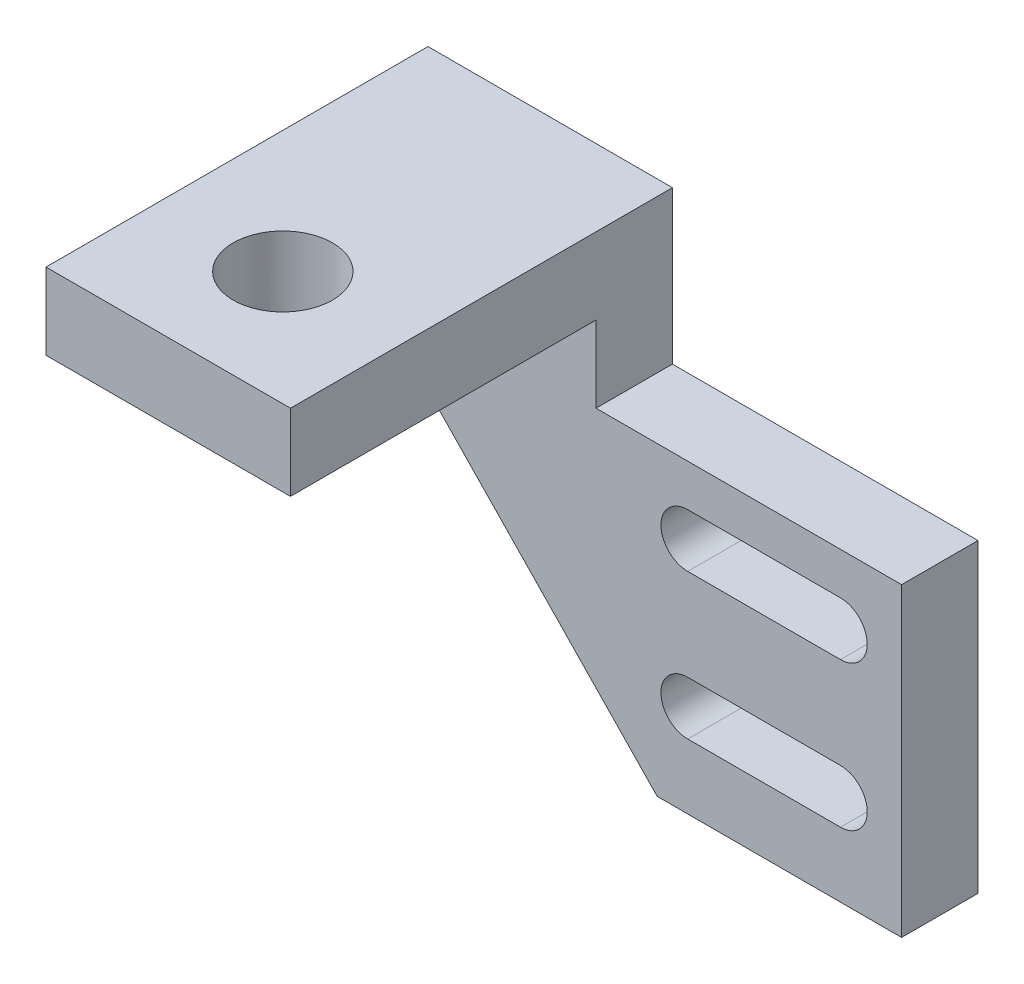
ISO-10303-21;
HEADER;
FILE_DESCRIPTION(('STEP AP214'),'2;1');
FILE_NAME('part.step','',(''),(''),'','','');
FILE_SCHEMA(('AUTOMOTIVE_DESIGN { 1 0 10303 214 1 1 1 1 }'));
ENDSEC;
DATA;
#1=APPLICATION_CONTEXT('core data for automotive mechanical design processes');
#2=APPLICATION_PROTOCOL_DEFINITION('international standard','automotive_design',2000,#1);
#3=PRODUCT_CONTEXT('',#1,'mechanical');
#4=PRODUCT('Part','Part','',(#3));
#5=PRODUCT_RELATED_PRODUCT_CATEGORY('part','',(#4));
#6=PRODUCT_DEFINITION_FORMATION('','',#4);
#7=PRODUCT_DEFINITION_CONTEXT('part definition',#1,'design');
#8=PRODUCT_DEFINITION('design','',#6,#7);
#9=PRODUCT_DEFINITION_SHAPE('','',#8);
#10=(LENGTH_UNIT() NAMED_UNIT(*) SI_UNIT(.MILLI.,.METRE.));
#11=(NAMED_UNIT(*) PLANE_ANGLE_UNIT() SI_UNIT($,.RADIAN.));
#12=(NAMED_UNIT(*) SI_UNIT($,.STERADIAN.) SOLID_ANGLE_UNIT());
#13=UNCERTAINTY_MEASURE_WITH_UNIT(LENGTH_MEASURE(1.E-05),#10,'distance_accuracy_value','');
#14=(GEOMETRIC_REPRESENTATION_CONTEXT(3) GLOBAL_UNCERTAINTY_ASSIGNED_CONTEXT((#13)) GLOBAL_UNIT_ASSIGNED_CONTEXT((#10,
#11,#12)) REPRESENTATION_CONTEXT('',''));
#15=CARTESIAN_POINT('',(0.,0.,0.));
#16=DIRECTION('',(0.,0.,1.));
#17=DIRECTION('',(1.,0.,0.));
#18=AXIS2_PLACEMENT_3D('',#15,#16,#17);
#19=CARTESIAN_POINT('',(0.,0.,5.));
#20=DIRECTION('',(0.,0.,-1.));
#21=DIRECTION('',(-1.,0.,0.));
#22=AXIS2_PLACEMENT_3D('',#19,#20,#21);
#23=PLANE('',#22);
#24=CARTESIAN_POINT('',(16.,-14.5,5.));
#25=DIRECTION('',(0.,0.,1.));
#26=DIRECTION('',(1.,0.,0.));
#27=AXIS2_PLACEMENT_3D('',#24,#25,#26);
#28=CIRCLE('',#27,1.75);
#29=CARTESIAN_POINT('',(16.,-16.25,5.));
#30=VERTEX_POINT('',#29);
#31=CARTESIAN_POINT('',(16.,-12.75,5.));
#32=VERTEX_POINT('',#31);
#33=EDGE_CURVE('E193',#30,#32,#28,.T.);
#34=ORIENTED_EDGE('',*,*,#33,.F.);
#35=DIRECTION('',(1.,0.,0.));
#36=VECTOR('',#35,1.);
#37=CARTESIAN_POINT('',(16.,-16.25,5.));
#38=LINE('',#37,#36);
#39=CARTESIAN_POINT('',(6.,-16.25,5.));
#40=VERTEX_POINT('',#39);
#41=EDGE_CURVE('E213',#40,#30,#38,.T.);
#42=ORIENTED_EDGE('',*,*,#41,.F.);
#43=CARTESIAN_POINT('',(6.,-14.5,5.));
#44=DIRECTION('',(0.,0.,1.));
#45=DIRECTION('',(1.,0.,0.));
#46=AXIS2_PLACEMENT_3D('',#43,#44,#45);
#47=CIRCLE('',#46,1.75);
#48=CARTESIAN_POINT('',(6.,-12.75,5.));
#49=VERTEX_POINT('',#48);
#50=EDGE_CURVE('E527',#49,#40,#47,.T.);
#51=ORIENTED_EDGE('',*,*,#50,.F.);
#52=DIRECTION('',(-1.,0.,0.));
#53=VECTOR('',#52,1.);
#54=CARTESIAN_POINT('',(16.,-12.75,5.));
#55=LINE('',#54,#53);
#56=EDGE_CURVE('E526',#32,#49,#55,.T.);
#57=ORIENTED_EDGE('',*,*,#56,.F.);
#58=EDGE_LOOP('',(#34,#42,#51,#57));
#59=FACE_BOUND('',#58,.T.);
#60=CARTESIAN_POINT('',(16.,-24.,5.));
#61=DIRECTION('',(0.,0.,1.));
#62=DIRECTION('',(1.,0.,0.));
#63=AXIS2_PLACEMENT_3D('',#60,#61,#62);
#64=CIRCLE('',#63,1.75);
#65=CARTESIAN_POINT('',(16.,-25.75,5.));
#66=VERTEX_POINT('',#65);
#67=CARTESIAN_POINT('',(16.,-22.25,5.));
#68=VERTEX_POINT('',#67);
#69=EDGE_CURVE('E230',#66,#68,#64,.T.);
#70=ORIENTED_EDGE('',*,*,#69,.F.);
#71=DIRECTION('',(1.,0.,0.));
#72=VECTOR('',#71,1.);
#73=CARTESIAN_POINT('',(16.,-25.75,5.));
#74=LINE('',#73,#72);
#75=CARTESIAN_POINT('',(6.,-25.75,5.));
#76=VERTEX_POINT('',#75);
#77=EDGE_CURVE('E238',#76,#66,#74,.T.);
#78=ORIENTED_EDGE('',*,*,#77,.F.);
#79=CARTESIAN_POINT('',(6.,-24.,5.));
#80=DIRECTION('',(0.,0.,1.));
#81=DIRECTION('',(1.,0.,0.));
#82=AXIS2_PLACEMENT_3D('',#79,#80,#81);
#83=CIRCLE('',#82,1.75000000000001);
#84=CARTESIAN_POINT('',(6.,-22.25,5.));
#85=VERTEX_POINT('',#84);
#86=EDGE_CURVE('E235',#85,#76,#83,.T.);
#87=ORIENTED_EDGE('',*,*,#86,.F.);
#88=DIRECTION('',(-1.,0.,0.));
#89=VECTOR('',#88,1.);
#90=CARTESIAN_POINT('',(16.,-22.25,5.));
#91=LINE('',#90,#89);
#92=EDGE_CURVE('E232',#68,#85,#91,.T.);
#93=ORIENTED_EDGE('',*,*,#92,.F.);
#94=EDGE_LOOP('',(#70,#78,#87,#93));
#95=FACE_BOUND('',#94,.T.);
#96=DIRECTION('',(1.,0.,0.));
#97=VECTOR('',#96,1.);
#98=CARTESIAN_POINT('',(-16.,-5.,5.));
#99=LINE('',#98,#97);
#100=CARTESIAN_POINT('',(-16.,-5.,5.));
#101=VERTEX_POINT('',#100);
#102=CARTESIAN_POINT('',(0.,-5.,5.));
#103=VERTEX_POINT('',#102);
#104=EDGE_CURVE('E52',#101,#103,#99,.T.);
#105=ORIENTED_EDGE('',*,*,#104,.F.);
#106=DIRECTION('',(0.,-1.,0.));
#107=VECTOR('',#106,1.);
#108=CARTESIAN_POINT('',(-16.,-9.29520131554418,5.));
#109=LINE('',#108,#107);
#110=CARTESIAN_POINT('',(-16.,-9.29520131554418,5.));
#111=VERTEX_POINT('',#110);
#112=EDGE_CURVE('E265',#101,#111,#109,.T.);
#113=ORIENTED_EDGE('',*,*,#112,.T.);
#114=DIRECTION('',(0.694759174123314,-0.7192424417201,0.));
#115=VECTOR('',#114,1.);
#116=CARTESIAN_POINT('',(4.,-30.,5.));
#117=LINE('',#116,#115);
#118=CARTESIAN_POINT('',(4.,-30.,5.));
#119=VERTEX_POINT('',#118);
#120=EDGE_CURVE('E263',#111,#119,#117,.T.);
#121=ORIENTED_EDGE('',*,*,#120,.T.);
#122=DIRECTION('',(1.,0.,0.));
#123=VECTOR('',#122,1.);
#124=CARTESIAN_POINT('',(20.,-30.,5.));
#125=LINE('',#124,#123);
#126=CARTESIAN_POINT('',(20.,-30.,5.));
#127=VERTEX_POINT('',#126);
#128=EDGE_CURVE('E295',#119,#127,#125,.T.);
#129=ORIENTED_EDGE('',*,*,#128,.T.);
#130=DIRECTION('',(0.,1.,0.));
#131=VECTOR('',#130,1.);
#132=CARTESIAN_POINT('',(20.,-10.,5.));
#133=LINE('',#132,#131);
#134=CARTESIAN_POINT('',(20.,-10.,5.));
#135=VERTEX_POINT('',#134);
#136=EDGE_CURVE('E294',#127,#135,#133,.T.);
#137=ORIENTED_EDGE('',*,*,#136,.T.);
#138=DIRECTION('',(-1.,0.,0.));
#139=VECTOR('',#138,1.);
#140=CARTESIAN_POINT('',(0.,-9.99999999999999,5.));
#141=LINE('',#140,#139);
#142=CARTESIAN_POINT('',(0.,-9.99999999999999,5.));
#143=VERTEX_POINT('',#142);
#144=EDGE_CURVE('E292',#135,#143,#141,.T.);
#145=ORIENTED_EDGE('',*,*,#144,.T.);
#146=DIRECTION('',(0.,1.,0.));
#147=VECTOR('',#146,1.);
#148=CARTESIAN_POINT('',(0.,0.,5.));
#149=LINE('',#148,#147);
#150=EDGE_CURVE('E168',#143,#103,#149,.T.);
#151=ORIENTED_EDGE('',*,*,#150,.T.);
#152=EDGE_LOOP('',(#105,#113,#121,#129,#137,#145,#151));
#153=FACE_BOUND('',#152,.T.);
#154=ADVANCED_FACE('F35',(#59,#95,#153),#23,.F.);
#155=CARTESIAN_POINT('',(0.,0.,0.));
#156=DIRECTION('',(0.,0.,-1.));
#157=DIRECTION('',(-1.,0.,0.));
#158=AXIS2_PLACEMENT_3D('',#155,#156,#157);
#159=PLANE('',#158);
#160=DIRECTION('',(1.,0.,0.));
#161=VECTOR('',#160,1.);
#162=CARTESIAN_POINT('',(16.,-25.75,0.));
#163=LINE('',#162,#161);
#164=CARTESIAN_POINT('',(6.,-25.75,0.));
#165=VERTEX_POINT('',#164);
#166=CARTESIAN_POINT('',(16.,-25.75,0.));
#167=VERTEX_POINT('',#166);
#168=EDGE_CURVE('E233',#165,#167,#163,.T.);
#169=ORIENTED_EDGE('',*,*,#168,.T.);
#170=CARTESIAN_POINT('',(16.,-24.,0.));
#171=DIRECTION('',(0.,0.,1.));
#172=DIRECTION('',(1.,0.,0.));
#173=AXIS2_PLACEMENT_3D('',#170,#171,#172);
#174=CIRCLE('',#173,1.75);
#175=CARTESIAN_POINT('',(16.,-22.25,0.));
#176=VERTEX_POINT('',#175);
#177=EDGE_CURVE('E229',#167,#176,#174,.T.);
#178=ORIENTED_EDGE('',*,*,#177,.T.);
#179=DIRECTION('',(-1.,0.,0.));
#180=VECTOR('',#179,1.);
#181=CARTESIAN_POINT('',(16.,-22.25,0.));
#182=LINE('',#181,#180);
#183=CARTESIAN_POINT('',(6.,-22.25,0.));
#184=VERTEX_POINT('',#183);
#185=EDGE_CURVE('E243',#176,#184,#182,.T.);
#186=ORIENTED_EDGE('',*,*,#185,.T.);
#187=CARTESIAN_POINT('',(6.,-24.,0.));
#188=DIRECTION('',(0.,0.,1.));
#189=DIRECTION('',(1.,0.,0.));
#190=AXIS2_PLACEMENT_3D('',#187,#188,#189);
#191=CIRCLE('',#190,1.75000000000001);
#192=EDGE_CURVE('E246',#184,#165,#191,.T.);
#193=ORIENTED_EDGE('',*,*,#192,.T.);
#194=EDGE_LOOP('',(#169,#178,#186,#193));
#195=FACE_BOUND('',#194,.T.);
#196=DIRECTION('',(0.,-1.,0.));
#197=VECTOR('',#196,1.);
#198=CARTESIAN_POINT('',(-16.,-9.29520131554418,0.));
#199=LINE('',#198,#197);
#200=CARTESIAN_POINT('',(-16.,0.,0.));
#201=VERTEX_POINT('',#200);
#202=CARTESIAN_POINT('',(-16.,-9.29520131554418,0.));
#203=VERTEX_POINT('',#202);
#204=EDGE_CURVE('E260',#201,#203,#199,.T.);
#205=ORIENTED_EDGE('',*,*,#204,.F.);
#206=DIRECTION('',(-1.,0.,0.));
#207=VECTOR('',#206,1.);
#208=CARTESIAN_POINT('',(-16.,0.,0.));
#209=LINE('',#208,#207);
#210=CARTESIAN_POINT('',(0.,0.,0.));
#211=VERTEX_POINT('',#210);
#212=EDGE_CURVE('E163',#211,#201,#209,.T.);
#213=ORIENTED_EDGE('',*,*,#212,.F.);
#214=DIRECTION('',(0.,1.,0.));
#215=VECTOR('',#214,1.);
#216=CARTESIAN_POINT('',(0.,0.,0.));
#217=LINE('',#216,#215);
#218=CARTESIAN_POINT('',(0.,-9.99999999999999,0.));
#219=VERTEX_POINT('',#218);
#220=EDGE_CURVE('E280',#219,#211,#217,.T.);
#221=ORIENTED_EDGE('',*,*,#220,.F.);
#222=DIRECTION('',(-1.,0.,0.));
#223=VECTOR('',#222,1.);
#224=CARTESIAN_POINT('',(0.,-9.99999999999999,0.));
#225=LINE('',#224,#223);
#226=CARTESIAN_POINT('',(20.,-10.,0.));
#227=VERTEX_POINT('',#226);
#228=EDGE_CURVE('E282',#227,#219,#225,.T.);
#229=ORIENTED_EDGE('',*,*,#228,.F.);
#230=DIRECTION('',(0.,1.,0.));
#231=VECTOR('',#230,1.);
#232=CARTESIAN_POINT('',(20.,-10.,0.));
#233=LINE('',#232,#231);
#234=CARTESIAN_POINT('',(20.,-30.,0.));
#235=VERTEX_POINT('',#234);
#236=EDGE_CURVE('E284',#235,#227,#233,.T.);
#237=ORIENTED_EDGE('',*,*,#236,.F.);
#238=DIRECTION('',(1.,0.,0.));
#239=VECTOR('',#238,1.);
#240=CARTESIAN_POINT('',(20.,-30.,0.));
#241=LINE('',#240,#239);
#242=CARTESIAN_POINT('',(4.,-30.,0.));
#243=VERTEX_POINT('',#242);
#244=EDGE_CURVE('E286',#243,#235,#241,.T.);
#245=ORIENTED_EDGE('',*,*,#244,.F.);
#246=DIRECTION('',(0.694759174123314,-0.7192424417201,0.));
#247=VECTOR('',#246,1.);
#248=CARTESIAN_POINT('',(4.,-30.,0.));
#249=LINE('',#248,#247);
#250=EDGE_CURVE('E288',#203,#243,#249,.T.);
#251=ORIENTED_EDGE('',*,*,#250,.F.);
#252=EDGE_LOOP('',(#205,#213,#221,#229,#237,#245,#251));
#253=FACE_BOUND('',#252,.T.);
#254=DIRECTION('',(1.,0.,0.));
#255=VECTOR('',#254,1.);
#256=CARTESIAN_POINT('',(16.,-16.25,0.));
#257=LINE('',#256,#255);
#258=CARTESIAN_POINT('',(6.,-16.25,0.));
#259=VERTEX_POINT('',#258);
#260=CARTESIAN_POINT('',(16.,-16.25,0.));
#261=VERTEX_POINT('',#260);
#262=EDGE_CURVE('E218',#259,#261,#257,.T.);
#263=ORIENTED_EDGE('',*,*,#262,.T.);
#264=CARTESIAN_POINT('',(16.,-14.5,0.));
#265=DIRECTION('',(0.,0.,1.));
#266=DIRECTION('',(1.,0.,0.));
#267=AXIS2_PLACEMENT_3D('',#264,#265,#266);
#268=CIRCLE('',#267,1.75);
#269=CARTESIAN_POINT('',(16.,-12.75,0.));
#270=VERTEX_POINT('',#269);
#271=EDGE_CURVE('E202',#261,#270,#268,.T.);
#272=ORIENTED_EDGE('',*,*,#271,.T.);
#273=DIRECTION('',(-1.,0.,0.));
#274=VECTOR('',#273,1.);
#275=CARTESIAN_POINT('',(16.,-12.75,0.));
#276=LINE('',#275,#274);
#277=CARTESIAN_POINT('',(6.,-12.75,0.));
#278=VERTEX_POINT('',#277);
#279=EDGE_CURVE('E205',#270,#278,#276,.T.);
#280=ORIENTED_EDGE('',*,*,#279,.T.);
#281=CARTESIAN_POINT('',(6.,-14.5,0.));
#282=DIRECTION('',(0.,0.,1.));
#283=DIRECTION('',(1.,0.,0.));
#284=AXIS2_PLACEMENT_3D('',#281,#282,#283);
#285=CIRCLE('',#284,1.75);
#286=EDGE_CURVE('E210',#278,#259,#285,.T.);
#287=ORIENTED_EDGE('',*,*,#286,.T.);
#288=EDGE_LOOP('',(#263,#272,#280,#287));
#289=FACE_BOUND('',#288,.T.);
#290=ADVANCED_FACE('F336',(#195,#253,#289),#159,.T.);
#291=CARTESIAN_POINT('',(-16.,-9.29520131554418,5.));
#292=DIRECTION('',(1.,0.,0.));
#293=DIRECTION('',(0.,0.,-1.));
#294=AXIS2_PLACEMENT_3D('',#291,#292,#293);
#295=PLANE('',#294);
#296=ORIENTED_EDGE('',*,*,#204,.T.);
#297=DIRECTION('',(0.,0.,-1.));
#298=VECTOR('',#297,1.);
#299=CARTESIAN_POINT('',(-16.,-9.29520131554418,5.));
#300=LINE('',#299,#298);
#301=EDGE_CURVE('E11',#111,#203,#300,.T.);
#302=ORIENTED_EDGE('',*,*,#301,.F.);
#303=ORIENTED_EDGE('',*,*,#112,.F.);
#304=DIRECTION('',(0.,0.,-1.));
#305=VECTOR('',#304,1.);
#306=CARTESIAN_POINT('',(-16.,-5.,25.));
#307=LINE('',#306,#305);
#308=CARTESIAN_POINT('',(-16.,-5.,25.));
#309=VERTEX_POINT('',#308);
#310=EDGE_CURVE('E173',#309,#101,#307,.T.);
#311=ORIENTED_EDGE('',*,*,#310,.F.);
#312=DIRECTION('',(0.,-1.,0.));
#313=VECTOR('',#312,1.);
#314=CARTESIAN_POINT('',(-16.,0.,25.));
#315=LINE('',#314,#313);
#316=CARTESIAN_POINT('',(-16.,0.,25.));
#317=VERTEX_POINT('',#316);
#318=EDGE_CURVE('E171',#317,#309,#315,.T.);
#319=ORIENTED_EDGE('',*,*,#318,.F.);
#320=DIRECTION('',(0.,0.,-1.));
#321=VECTOR('',#320,1.);
#322=CARTESIAN_POINT('',(-16.,0.,5.));
#323=LINE('',#322,#321);
#324=EDGE_CURVE('E156',#317,#201,#323,.T.);
#325=ORIENTED_EDGE('',*,*,#324,.T.);
#326=EDGE_LOOP('',(#296,#302,#303,#311,#319,#325));
#327=FACE_BOUND('',#326,.T.);
#328=ADVANCED_FACE('F37',(#327),#295,.F.);
#329=CARTESIAN_POINT('',(4.,-30.,5.));
#330=DIRECTION('',(0.7192424417201,0.694759174123314,0.));
#331=DIRECTION('',(-0.694759174123314,0.7192424417201,0.));
#332=AXIS2_PLACEMENT_3D('',#329,#330,#331);
#333=PLANE('',#332);
#334=ORIENTED_EDGE('',*,*,#250,.T.);
#335=DIRECTION('',(0.,0.,-1.));
#336=VECTOR('',#335,1.);
#337=CARTESIAN_POINT('',(4.,-30.,5.));
#338=LINE('',#337,#336);
#339=EDGE_CURVE('E44',#119,#243,#338,.T.);
#340=ORIENTED_EDGE('',*,*,#339,.F.);
#341=ORIENTED_EDGE('',*,*,#120,.F.);
#342=ORIENTED_EDGE('',*,*,#301,.T.);
#343=EDGE_LOOP('',(#334,#340,#341,#342));
#344=FACE_BOUND('',#343,.T.);
#345=ADVANCED_FACE('F302',(#344),#333,.F.);
#346=CARTESIAN_POINT('',(20.,-30.,5.));
#347=DIRECTION('',(0.,1.,0.));
#348=DIRECTION('',(-1.,0.,0.));
#349=AXIS2_PLACEMENT_3D('',#346,#347,#348);
#350=PLANE('',#349);
#351=ORIENTED_EDGE('',*,*,#244,.T.);
#352=DIRECTION('',(0.,0.,-1.));
#353=VECTOR('',#352,1.);
#354=CARTESIAN_POINT('',(20.,-30.,5.));
#355=LINE('',#354,#353);
#356=EDGE_CURVE('E269',#127,#235,#355,.T.);
#357=ORIENTED_EDGE('',*,*,#356,.F.);
#358=ORIENTED_EDGE('',*,*,#128,.F.);
#359=ORIENTED_EDGE('',*,*,#339,.T.);
#360=EDGE_LOOP('',(#351,#357,#358,#359));
#361=FACE_BOUND('',#360,.T.);
#362=ADVANCED_FACE('F305',(#361),#350,.F.);
#363=CARTESIAN_POINT('',(20.,-10.,5.));
#364=DIRECTION('',(-1.,0.,0.));
#365=DIRECTION('',(0.,-1.,0.));
#366=AXIS2_PLACEMENT_3D('',#363,#364,#365);
#367=PLANE('',#366);
#368=ORIENTED_EDGE('',*,*,#236,.T.);
#369=DIRECTION('',(0.,0.,-1.));
#370=VECTOR('',#369,1.);
#371=CARTESIAN_POINT('',(20.,-10.,5.));
#372=LINE('',#371,#370);
#373=EDGE_CURVE('E272',#135,#227,#372,.T.);
#374=ORIENTED_EDGE('',*,*,#373,.F.);
#375=ORIENTED_EDGE('',*,*,#136,.F.);
#376=ORIENTED_EDGE('',*,*,#356,.T.);
#377=EDGE_LOOP('',(#368,#374,#375,#376));
#378=FACE_BOUND('',#377,.T.);
#379=ADVANCED_FACE('F310',(#378),#367,.F.);
#380=CARTESIAN_POINT('',(0.,-9.99999999999999,5.));
#381=DIRECTION('',(0.,-1.,0.));
#382=DIRECTION('',(1.,0.,0.));
#383=AXIS2_PLACEMENT_3D('',#380,#381,#382);
#384=PLANE('',#383);
#385=ORIENTED_EDGE('',*,*,#228,.T.);
#386=DIRECTION('',(0.,0.,-1.));
#387=VECTOR('',#386,1.);
#388=CARTESIAN_POINT('',(0.,-9.99999999999999,5.));
#389=LINE('',#388,#387);
#390=EDGE_CURVE('E275',#143,#219,#389,.T.);
#391=ORIENTED_EDGE('',*,*,#390,.F.);
#392=ORIENTED_EDGE('',*,*,#144,.F.);
#393=ORIENTED_EDGE('',*,*,#373,.T.);
#394=EDGE_LOOP('',(#385,#391,#392,#393));
#395=FACE_BOUND('',#394,.T.);
#396=ADVANCED_FACE('F315',(#395),#384,.F.);
#397=CARTESIAN_POINT('',(0.,0.,5.));
#398=DIRECTION('',(-1.,0.,0.));
#399=DIRECTION('',(0.,0.,1.));
#400=AXIS2_PLACEMENT_3D('',#397,#398,#399);
#401=PLANE('',#400);
#402=ORIENTED_EDGE('',*,*,#220,.T.);
#403=DIRECTION('',(0.,0.,-1.));
#404=VECTOR('',#403,1.);
#405=CARTESIAN_POINT('',(0.,0.,5.));
#406=LINE('',#405,#404);
#407=CARTESIAN_POINT('',(0.,0.,25.));
#408=VERTEX_POINT('',#407);
#409=EDGE_CURVE('E167',#408,#211,#406,.T.);
#410=ORIENTED_EDGE('',*,*,#409,.F.);
#411=DIRECTION('',(0.,1.,0.));
#412=VECTOR('',#411,1.);
#413=CARTESIAN_POINT('',(0.,-5.,25.));
#414=LINE('',#413,#412);
#415=CARTESIAN_POINT('',(0.,-5.,25.));
#416=VERTEX_POINT('',#415);
#417=EDGE_CURVE('E181',#416,#408,#414,.T.);
#418=ORIENTED_EDGE('',*,*,#417,.F.);
#419=DIRECTION('',(0.,0.,-1.));
#420=VECTOR('',#419,1.);
#421=CARTESIAN_POINT('',(0.,-5.,25.));
#422=LINE('',#421,#420);
#423=EDGE_CURVE('E190',#416,#103,#422,.T.);
#424=ORIENTED_EDGE('',*,*,#423,.T.);
#425=ORIENTED_EDGE('',*,*,#150,.F.);
#426=ORIENTED_EDGE('',*,*,#390,.T.);
#427=EDGE_LOOP('',(#402,#410,#418,#424,#425,#426));
#428=FACE_BOUND('',#427,.T.);
#429=ADVANCED_FACE('F319',(#428),#401,.F.);
#430=CARTESIAN_POINT('',(-16.,0.,5.));
#431=DIRECTION('',(0.,-1.,0.));
#432=DIRECTION('',(0.,0.,-1.));
#433=AXIS2_PLACEMENT_3D('',#430,#431,#432);
#434=PLANE('',#433);
#435=CARTESIAN_POINT('',(-8.,0.,17.5));
#436=DIRECTION('',(0.,-1.,0.));
#437=DIRECTION('',(0.,0.,-1.));
#438=AXIS2_PLACEMENT_3D('',#435,#436,#437);
#439=CIRCLE('',#438,3.25);
#440=CARTESIAN_POINT('',(-8.,0.,14.25));
#441=VERTEX_POINT('',#440);
#442=EDGE_CURVE('E183',#441,#441,#439,.F.);
#443=ORIENTED_EDGE('',*,*,#442,.F.);
#444=EDGE_LOOP('',(#443));
#445=FACE_BOUND('',#444,.T.);
#446=ORIENTED_EDGE('',*,*,#212,.T.);
#447=ORIENTED_EDGE('',*,*,#324,.F.);
#448=DIRECTION('',(-1.,0.,0.));
#449=VECTOR('',#448,1.);
#450=CARTESIAN_POINT('',(0.,0.,25.));
#451=LINE('',#450,#449);
#452=EDGE_CURVE('E161',#408,#317,#451,.T.);
#453=ORIENTED_EDGE('',*,*,#452,.F.);
#454=ORIENTED_EDGE('',*,*,#409,.T.);
#455=EDGE_LOOP('',(#446,#447,#453,#454));
#456=FACE_BOUND('',#455,.T.);
#457=ADVANCED_FACE('F158',(#445,#456),#434,.F.);
#458=CARTESIAN_POINT('',(16.,-24.,5.));
#459=DIRECTION('',(0.,0.,-1.));
#460=DIRECTION('',(-1.,0.,0.));
#461=AXIS2_PLACEMENT_3D('',#458,#459,#460);
#462=CYLINDRICAL_SURFACE('',#461,1.75);
#463=ORIENTED_EDGE('',*,*,#177,.F.);
#464=DIRECTION('',(0.,0.,-1.));
#465=VECTOR('',#464,1.);
#466=CARTESIAN_POINT('',(16.,-25.75,5.));
#467=LINE('',#466,#465);
#468=EDGE_CURVE('E240',#66,#167,#467,.T.);
#469=ORIENTED_EDGE('',*,*,#468,.F.);
#470=ORIENTED_EDGE('',*,*,#69,.T.);
#471=DIRECTION('',(0.,0.,-1.));
#472=VECTOR('',#471,1.);
#473=CARTESIAN_POINT('',(16.,-22.25,5.));
#474=LINE('',#473,#472);
#475=EDGE_CURVE('E257',#68,#176,#474,.T.);
#476=ORIENTED_EDGE('',*,*,#475,.T.);
#477=EDGE_LOOP('',(#463,#469,#470,#476));
#478=FACE_BOUND('',#477,.T.);
#479=ADVANCED_FACE('F347',(#478),#462,.F.);
#480=CARTESIAN_POINT('',(16.,-22.25,5.));
#481=DIRECTION('',(0.,-1.,0.));
#482=DIRECTION('',(1.,0.,0.));
#483=AXIS2_PLACEMENT_3D('',#480,#481,#482);
#484=PLANE('',#483);
#485=ORIENTED_EDGE('',*,*,#185,.F.);
#486=ORIENTED_EDGE('',*,*,#475,.F.);
#487=ORIENTED_EDGE('',*,*,#92,.T.);
#488=DIRECTION('',(0.,0.,-1.));
#489=VECTOR('',#488,1.);
#490=CARTESIAN_POINT('',(6.,-22.25,5.));
#491=LINE('',#490,#489);
#492=EDGE_CURVE('E255',#85,#184,#491,.T.);
#493=ORIENTED_EDGE('',*,*,#492,.T.);
#494=EDGE_LOOP('',(#485,#486,#487,#493));
#495=FACE_BOUND('',#494,.T.);
#496=ADVANCED_FACE('F404',(#495),#484,.T.);
#497=CARTESIAN_POINT('',(6.,-24.,5.));
#498=DIRECTION('',(0.,0.,-1.));
#499=DIRECTION('',(-1.,0.,0.));
#500=AXIS2_PLACEMENT_3D('',#497,#498,#499);
#501=CYLINDRICAL_SURFACE('',#500,1.75000000000001);
#502=ORIENTED_EDGE('',*,*,#192,.F.);
#503=ORIENTED_EDGE('',*,*,#492,.F.);
#504=ORIENTED_EDGE('',*,*,#86,.T.);
#505=DIRECTION('',(0.,0.,-1.));
#506=VECTOR('',#505,1.);
#507=CARTESIAN_POINT('',(6.,-25.75,5.));
#508=LINE('',#507,#506);
#509=EDGE_CURVE('E253',#76,#165,#508,.T.);
#510=ORIENTED_EDGE('',*,*,#509,.T.);
#511=EDGE_LOOP('',(#502,#503,#504,#510));
#512=FACE_BOUND('',#511,.T.);
#513=ADVANCED_FACE('F414',(#512),#501,.F.);
#514=CARTESIAN_POINT('',(16.,-25.75,5.));
#515=DIRECTION('',(0.,1.,0.));
#516=DIRECTION('',(-1.,0.,0.));
#517=AXIS2_PLACEMENT_3D('',#514,#515,#516);
#518=PLANE('',#517);
#519=ORIENTED_EDGE('',*,*,#168,.F.);
#520=ORIENTED_EDGE('',*,*,#509,.F.);
#521=ORIENTED_EDGE('',*,*,#77,.T.);
#522=ORIENTED_EDGE('',*,*,#468,.T.);
#523=EDGE_LOOP('',(#519,#520,#521,#522));
#524=FACE_BOUND('',#523,.T.);
#525=ADVANCED_FACE('F423',(#524),#518,.T.);
#526=CARTESIAN_POINT('',(16.,-14.5,5.));
#527=DIRECTION('',(0.,0.,-1.));
#528=DIRECTION('',(-1.,0.,0.));
#529=AXIS2_PLACEMENT_3D('',#526,#527,#528);
#530=CYLINDRICAL_SURFACE('',#529,1.75);
#531=ORIENTED_EDGE('',*,*,#271,.F.);
#532=DIRECTION('',(0.,0.,-1.));
#533=VECTOR('',#532,1.);
#534=CARTESIAN_POINT('',(16.,-16.25,5.));
#535=LINE('',#534,#533);
#536=EDGE_CURVE('E220',#30,#261,#535,.T.);
#537=ORIENTED_EDGE('',*,*,#536,.F.);
#538=ORIENTED_EDGE('',*,*,#33,.T.);
#539=DIRECTION('',(0.,0.,-1.));
#540=VECTOR('',#539,1.);
#541=CARTESIAN_POINT('',(16.,-12.75,5.));
#542=LINE('',#541,#540);
#543=EDGE_CURVE('E226',#32,#270,#542,.T.);
#544=ORIENTED_EDGE('',*,*,#543,.T.);
#545=EDGE_LOOP('',(#531,#537,#538,#544));
#546=FACE_BOUND('',#545,.T.);
#547=ADVANCED_FACE('F433',(#546),#530,.F.);
#548=CARTESIAN_POINT('',(16.,-12.75,5.));
#549=DIRECTION('',(0.,-1.,0.));
#550=DIRECTION('',(1.,0.,0.));
#551=AXIS2_PLACEMENT_3D('',#548,#549,#550);
#552=PLANE('',#551);
#553=ORIENTED_EDGE('',*,*,#279,.F.);
#554=ORIENTED_EDGE('',*,*,#543,.F.);
#555=ORIENTED_EDGE('',*,*,#56,.T.);
#556=DIRECTION('',(0.,0.,-1.));
#557=VECTOR('',#556,1.);
#558=CARTESIAN_POINT('',(6.,-12.75,5.));
#559=LINE('',#558,#557);
#560=EDGE_CURVE('E224',#49,#278,#559,.T.);
#561=ORIENTED_EDGE('',*,*,#560,.T.);
#562=EDGE_LOOP('',(#553,#554,#555,#561));
#563=FACE_BOUND('',#562,.T.);
#564=ADVANCED_FACE('F443',(#563),#552,.T.);
#565=CARTESIAN_POINT('',(6.,-14.5,5.));
#566=DIRECTION('',(0.,0.,-1.));
#567=DIRECTION('',(-1.,0.,0.));
#568=AXIS2_PLACEMENT_3D('',#565,#566,#567);
#569=CYLINDRICAL_SURFACE('',#568,1.75);
#570=ORIENTED_EDGE('',*,*,#286,.F.);
#571=ORIENTED_EDGE('',*,*,#560,.F.);
#572=ORIENTED_EDGE('',*,*,#50,.T.);
#573=DIRECTION('',(0.,0.,-1.));
#574=VECTOR('',#573,1.);
#575=CARTESIAN_POINT('',(6.,-16.25,5.));
#576=LINE('',#575,#574);
#577=EDGE_CURVE('E60',#40,#259,#576,.T.);
#578=ORIENTED_EDGE('',*,*,#577,.T.);
#579=EDGE_LOOP('',(#570,#571,#572,#578));
#580=FACE_BOUND('',#579,.T.);
#581=ADVANCED_FACE('F332',(#580),#569,.F.);
#582=CARTESIAN_POINT('',(16.,-16.25,5.));
#583=DIRECTION('',(0.,1.,0.));
#584=DIRECTION('',(-1.,0.,0.));
#585=AXIS2_PLACEMENT_3D('',#582,#583,#584);
#586=PLANE('',#585);
#587=ORIENTED_EDGE('',*,*,#262,.F.);
#588=ORIENTED_EDGE('',*,*,#577,.F.);
#589=ORIENTED_EDGE('',*,*,#41,.T.);
#590=ORIENTED_EDGE('',*,*,#536,.T.);
#591=EDGE_LOOP('',(#587,#588,#589,#590));
#592=FACE_BOUND('',#591,.T.);
#593=ADVANCED_FACE('F323',(#592),#586,.T.);
#594=CARTESIAN_POINT('',(-16.,-5.,25.));
#595=DIRECTION('',(0.,1.,0.));
#596=DIRECTION('',(-1.,0.,0.));
#597=AXIS2_PLACEMENT_3D('',#594,#595,#596);
#598=PLANE('',#597);
#599=CARTESIAN_POINT('',(-8.,-5.,17.5));
#600=DIRECTION('',(0.,-1.,0.));
#601=DIRECTION('',(1.,0.,0.));
#602=AXIS2_PLACEMENT_3D('',#599,#600,#601);
#603=CIRCLE('',#602,3.25);
#604=CARTESIAN_POINT('',(-4.75,-5.,17.5));
#605=VERTEX_POINT('',#604);
#606=EDGE_CURVE('E514',#605,#605,#603,.T.);
#607=ORIENTED_EDGE('',*,*,#606,.F.);
#608=EDGE_LOOP('',(#607));
#609=FACE_BOUND('',#608,.T.);
#610=ORIENTED_EDGE('',*,*,#104,.T.);
#611=ORIENTED_EDGE('',*,*,#423,.F.);
#612=DIRECTION('',(1.,0.,0.));
#613=VECTOR('',#612,1.);
#614=CARTESIAN_POINT('',(-16.,-5.,25.));
#615=LINE('',#614,#613);
#616=EDGE_CURVE('E176',#309,#416,#615,.T.);
#617=ORIENTED_EDGE('',*,*,#616,.F.);
#618=ORIENTED_EDGE('',*,*,#310,.T.);
#619=EDGE_LOOP('',(#610,#611,#617,#618));
#620=FACE_BOUND('',#619,.T.);
#621=ADVANCED_FACE('F321',(#609,#620),#598,.F.);
#622=CARTESIAN_POINT('',(0.,0.,25.));
#623=DIRECTION('',(0.,0.,1.));
#624=DIRECTION('',(1.,0.,0.));
#625=AXIS2_PLACEMENT_3D('',#622,#623,#624);
#626=PLANE('',#625);
#627=ORIENTED_EDGE('',*,*,#452,.T.);
#628=ORIENTED_EDGE('',*,*,#318,.T.);
#629=ORIENTED_EDGE('',*,*,#616,.T.);
#630=ORIENTED_EDGE('',*,*,#417,.T.);
#631=EDGE_LOOP('',(#627,#628,#629,#630));
#632=FACE_BOUND('',#631,.T.);
#633=ADVANCED_FACE('F179',(#632),#626,.T.);
#634=CARTESIAN_POINT('',(-8.,0.001000000000001,17.5));
#635=DIRECTION('',(0.,-1.,0.));
#636=DIRECTION('',(1.,0.,0.));
#637=AXIS2_PLACEMENT_3D('',#634,#635,#636);
#638=CYLINDRICAL_SURFACE('',#637,3.25);
#639=ORIENTED_EDGE('',*,*,#606,.T.);
#640=EDGE_LOOP('',(#639));
#641=FACE_BOUND('',#640,.T.);
#642=ORIENTED_EDGE('',*,*,#442,.T.);
#643=EDGE_LOOP('',(#642));
#644=FACE_BOUND('',#643,.T.);
#645=ADVANCED_FACE('F330',(#641,#644),#638,.F.);
#646=CLOSED_SHELL('',(#154,#290,#328,#345,#362,#379,#396,#429,#457,#479,#496,#513,#525,#547,
#564,#581,#593,#621,#633,#645));
#647=MANIFOLD_SOLID_BREP('B2',#646);
#648=ADVANCED_BREP_SHAPE_REPRESENTATION('',(#18,#647),#14);
#649=SHAPE_DEFINITION_REPRESENTATION(#9,#648);
ENDSEC;
END-ISO-10303-21;
